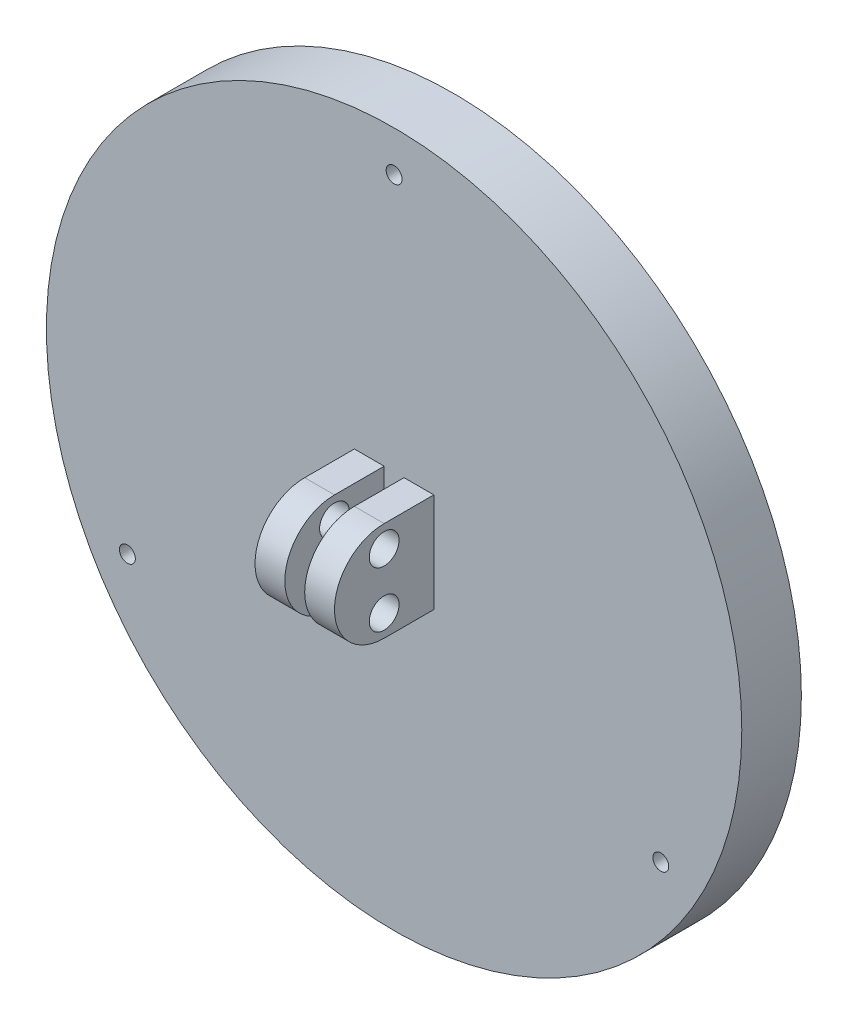
ISO-10303-21;
HEADER;
FILE_DESCRIPTION(('STEP AP214'),'2;1');
FILE_NAME('part.step','',(''),(''),'','','');
FILE_SCHEMA(('AUTOMOTIVE_DESIGN { 1 0 10303 214 1 1 1 1 }'));
ENDSEC;
DATA;
#1=APPLICATION_CONTEXT('core data for automotive mechanical design processes');
#2=APPLICATION_PROTOCOL_DEFINITION('international standard','automotive_design',2000,#1);
#3=PRODUCT_CONTEXT('',#1,'mechanical');
#4=PRODUCT('Part','Part','',(#3));
#5=PRODUCT_RELATED_PRODUCT_CATEGORY('part','',(#4));
#6=PRODUCT_DEFINITION_FORMATION('','',#4);
#7=PRODUCT_DEFINITION_CONTEXT('part definition',#1,'design');
#8=PRODUCT_DEFINITION('design','',#6,#7);
#9=PRODUCT_DEFINITION_SHAPE('','',#8);
#10=(LENGTH_UNIT() NAMED_UNIT(*) SI_UNIT(.MILLI.,.METRE.));
#11=(NAMED_UNIT(*) PLANE_ANGLE_UNIT() SI_UNIT($,.RADIAN.));
#12=(NAMED_UNIT(*) SI_UNIT($,.STERADIAN.) SOLID_ANGLE_UNIT());
#13=UNCERTAINTY_MEASURE_WITH_UNIT(LENGTH_MEASURE(1.E-05),#10,'distance_accuracy_value','');
#14=(GEOMETRIC_REPRESENTATION_CONTEXT(3) GLOBAL_UNCERTAINTY_ASSIGNED_CONTEXT((#13)) GLOBAL_UNIT_ASSIGNED_CONTEXT((#10,
#11,#12)) REPRESENTATION_CONTEXT('',''));
#15=CARTESIAN_POINT('',(0.,0.,0.));
#16=DIRECTION('',(0.,0.,1.));
#17=DIRECTION('',(1.,0.,0.));
#18=AXIS2_PLACEMENT_3D('',#15,#16,#17);
#19=CARTESIAN_POINT('',(0.999999999999999,5.,16.));
#20=DIRECTION('',(1.,0.,0.));
#21=DIRECTION('',(0.,1.,0.));
#22=AXIS2_PLACEMENT_3D('',#19,#20,#21);
#23=PLANE('',#22);
#24=CARTESIAN_POINT('',(1.,2.8,11.));
#25=DIRECTION('',(1.,0.,0.));
#26=DIRECTION('',(0.,1.,0.));
#27=AXIS2_PLACEMENT_3D('',#24,#25,#26);
#28=CIRCLE('',#27,1.5);
#29=CARTESIAN_POINT('',(1.,4.3,11.));
#30=VERTEX_POINT('',#29);
#31=EDGE_CURVE('E153',#30,#30,#28,.T.);
#32=ORIENTED_EDGE('',*,*,#31,.T.);
#33=EDGE_LOOP('',(#32));
#34=FACE_BOUND('',#33,.T.);
#35=CARTESIAN_POINT('',(1.,-2.8,11.));
#36=DIRECTION('',(1.,0.,0.));
#37=DIRECTION('',(0.,1.,0.));
#38=AXIS2_PLACEMENT_3D('',#35,#36,#37);
#39=CIRCLE('',#38,1.5);
#40=CARTESIAN_POINT('',(1.,-1.3,11.));
#41=VERTEX_POINT('',#40);
#42=EDGE_CURVE('E213',#41,#41,#39,.T.);
#43=ORIENTED_EDGE('',*,*,#42,.T.);
#44=EDGE_LOOP('',(#43));
#45=FACE_BOUND('',#44,.T.);
#46=DIRECTION('',(0.,0.,-1.));
#47=VECTOR('',#46,1.);
#48=CARTESIAN_POINT('',(1.,-5.,16.));
#49=LINE('',#48,#47);
#50=CARTESIAN_POINT('',(1.,-5.,11.));
#51=VERTEX_POINT('',#50);
#52=CARTESIAN_POINT('',(1.,-5.,6.));
#53=VERTEX_POINT('',#52);
#54=EDGE_CURVE('E160',#51,#53,#49,.T.);
#55=ORIENTED_EDGE('',*,*,#54,.F.);
#56=CARTESIAN_POINT('',(1.,0.,11.));
#57=DIRECTION('',(1.,0.,0.));
#58=DIRECTION('',(0.,1.,0.));
#59=AXIS2_PLACEMENT_3D('',#56,#57,#58);
#60=CIRCLE('',#59,5.);
#61=CARTESIAN_POINT('',(1.,5.,11.));
#62=VERTEX_POINT('',#61);
#63=EDGE_CURVE('E149',#51,#62,#60,.F.);
#64=ORIENTED_EDGE('',*,*,#63,.T.);
#65=DIRECTION('',(0.,0.,-1.));
#66=VECTOR('',#65,1.);
#67=CARTESIAN_POINT('',(0.999999999999999,5.,16.));
#68=LINE('',#67,#66);
#69=CARTESIAN_POINT('',(0.999999999999999,5.,6.));
#70=VERTEX_POINT('',#69);
#71=EDGE_CURVE('E166',#62,#70,#68,.T.);
#72=ORIENTED_EDGE('',*,*,#71,.T.);
#73=DIRECTION('',(0.,-1.,0.));
#74=VECTOR('',#73,1.);
#75=CARTESIAN_POINT('',(0.999999999999999,5.,6.));
#76=LINE('',#75,#74);
#77=EDGE_CURVE('E271',#70,#53,#76,.T.);
#78=ORIENTED_EDGE('',*,*,#77,.T.);
#79=EDGE_LOOP('',(#55,#64,#72,#78));
#80=FACE_BOUND('',#79,.T.);
#81=ADVANCED_FACE('F64',(#34,#45,#80),#23,.F.);
#82=CARTESIAN_POINT('',(4.,5.,16.));
#83=DIRECTION('',(-1.,0.,0.));
#84=DIRECTION('',(0.,-1.,0.));
#85=AXIS2_PLACEMENT_3D('',#82,#83,#84);
#86=PLANE('',#85);
#87=CARTESIAN_POINT('',(4.,2.8,11.));
#88=DIRECTION('',(1.,0.,0.));
#89=DIRECTION('',(0.,1.,0.));
#90=AXIS2_PLACEMENT_3D('',#87,#88,#89);
#91=CIRCLE('',#90,1.5);
#92=CARTESIAN_POINT('',(4.,4.3,11.));
#93=VERTEX_POINT('',#92);
#94=EDGE_CURVE('E207',#93,#93,#91,.T.);
#95=ORIENTED_EDGE('',*,*,#94,.F.);
#96=EDGE_LOOP('',(#95));
#97=FACE_BOUND('',#96,.T.);
#98=CARTESIAN_POINT('',(4.,-2.8,11.));
#99=DIRECTION('',(1.,0.,0.));
#100=DIRECTION('',(0.,1.,0.));
#101=AXIS2_PLACEMENT_3D('',#98,#99,#100);
#102=CIRCLE('',#101,1.5);
#103=CARTESIAN_POINT('',(4.,-1.3,11.));
#104=VERTEX_POINT('',#103);
#105=EDGE_CURVE('E216',#104,#104,#102,.T.);
#106=ORIENTED_EDGE('',*,*,#105,.F.);
#107=EDGE_LOOP('',(#106));
#108=FACE_BOUND('',#107,.T.);
#109=CARTESIAN_POINT('',(4.,0.,11.));
#110=DIRECTION('',(1.,0.,0.));
#111=DIRECTION('',(0.,1.,0.));
#112=AXIS2_PLACEMENT_3D('',#109,#110,#111);
#113=CIRCLE('',#112,5.);
#114=CARTESIAN_POINT('',(4.,-5.,11.));
#115=VERTEX_POINT('',#114);
#116=CARTESIAN_POINT('',(4.,5.,11.));
#117=VERTEX_POINT('',#116);
#118=EDGE_CURVE('E134',#115,#117,#113,.F.);
#119=ORIENTED_EDGE('',*,*,#118,.F.);
#120=DIRECTION('',(0.,0.,-1.));
#121=VECTOR('',#120,1.);
#122=CARTESIAN_POINT('',(4.,-5.,16.));
#123=LINE('',#122,#121);
#124=CARTESIAN_POINT('',(4.,-5.,6.));
#125=VERTEX_POINT('',#124);
#126=EDGE_CURVE('E138',#115,#125,#123,.T.);
#127=ORIENTED_EDGE('',*,*,#126,.T.);
#128=DIRECTION('',(0.,1.,0.));
#129=VECTOR('',#128,1.);
#130=CARTESIAN_POINT('',(4.,5.,6.));
#131=LINE('',#130,#129);
#132=CARTESIAN_POINT('',(4.,5.,6.));
#133=VERTEX_POINT('',#132);
#134=EDGE_CURVE('E277',#125,#133,#131,.T.);
#135=ORIENTED_EDGE('',*,*,#134,.T.);
#136=DIRECTION('',(0.,0.,-1.));
#137=VECTOR('',#136,1.);
#138=CARTESIAN_POINT('',(4.,5.,16.));
#139=LINE('',#138,#137);
#140=EDGE_CURVE('E90',#117,#133,#139,.T.);
#141=ORIENTED_EDGE('',*,*,#140,.F.);
#142=EDGE_LOOP('',(#119,#127,#135,#141));
#143=FACE_BOUND('',#142,.T.);
#144=ADVANCED_FACE('F136',(#97,#108,#143),#86,.F.);
#145=CARTESIAN_POINT('',(-1.,5.,16.));
#146=DIRECTION('',(-1.,0.,0.));
#147=DIRECTION('',(0.,-1.,0.));
#148=AXIS2_PLACEMENT_3D('',#145,#146,#147);
#149=PLANE('',#148);
#150=CARTESIAN_POINT('',(-1.,2.8,11.));
#151=DIRECTION('',(-1.,0.,0.));
#152=DIRECTION('',(0.,-1.,0.));
#153=AXIS2_PLACEMENT_3D('',#150,#151,#152);
#154=CIRCLE('',#153,1.5);
#155=CARTESIAN_POINT('',(-1.,1.3,11.));
#156=VERTEX_POINT('',#155);
#157=EDGE_CURVE('E227',#156,#156,#154,.T.);
#158=ORIENTED_EDGE('',*,*,#157,.T.);
#159=EDGE_LOOP('',(#158));
#160=FACE_BOUND('',#159,.T.);
#161=CARTESIAN_POINT('',(-1.,-2.8,11.));
#162=DIRECTION('',(-1.,0.,0.));
#163=DIRECTION('',(0.,-1.,0.));
#164=AXIS2_PLACEMENT_3D('',#161,#162,#163);
#165=CIRCLE('',#164,1.5);
#166=CARTESIAN_POINT('',(-1.,-4.3,11.));
#167=VERTEX_POINT('',#166);
#168=EDGE_CURVE('E206',#167,#167,#165,.T.);
#169=ORIENTED_EDGE('',*,*,#168,.T.);
#170=EDGE_LOOP('',(#169));
#171=FACE_BOUND('',#170,.T.);
#172=CARTESIAN_POINT('',(-1.,0.,11.));
#173=DIRECTION('',(-1.,0.,0.));
#174=DIRECTION('',(0.,-1.,0.));
#175=AXIS2_PLACEMENT_3D('',#172,#173,#174);
#176=CIRCLE('',#175,5.);
#177=CARTESIAN_POINT('',(-1.,5.,11.));
#178=VERTEX_POINT('',#177);
#179=CARTESIAN_POINT('',(-1.,-5.,11.));
#180=VERTEX_POINT('',#179);
#181=EDGE_CURVE('E241',#178,#180,#176,.F.);
#182=ORIENTED_EDGE('',*,*,#181,.T.);
#183=DIRECTION('',(0.,0.,-1.));
#184=VECTOR('',#183,1.);
#185=CARTESIAN_POINT('',(-0.999999999999999,-5.,16.));
#186=LINE('',#185,#184);
#187=CARTESIAN_POINT('',(-0.999999999999999,-5.,6.));
#188=VERTEX_POINT('',#187);
#189=EDGE_CURVE('E254',#180,#188,#186,.T.);
#190=ORIENTED_EDGE('',*,*,#189,.T.);
#191=DIRECTION('',(0.,1.,0.));
#192=VECTOR('',#191,1.);
#193=CARTESIAN_POINT('',(-1.,5.,6.));
#194=LINE('',#193,#192);
#195=CARTESIAN_POINT('',(-1.,5.,6.));
#196=VERTEX_POINT('',#195);
#197=EDGE_CURVE('E267',#188,#196,#194,.T.);
#198=ORIENTED_EDGE('',*,*,#197,.T.);
#199=DIRECTION('',(0.,0.,-1.));
#200=VECTOR('',#199,1.);
#201=CARTESIAN_POINT('',(-1.,5.,16.));
#202=LINE('',#201,#200);
#203=EDGE_CURVE('E246',#178,#196,#202,.T.);
#204=ORIENTED_EDGE('',*,*,#203,.F.);
#205=EDGE_LOOP('',(#182,#190,#198,#204));
#206=FACE_BOUND('',#205,.T.);
#207=ADVANCED_FACE('F304',(#160,#171,#206),#149,.F.);
#208=CARTESIAN_POINT('',(-4.,5.,16.));
#209=DIRECTION('',(1.,0.,0.));
#210=DIRECTION('',(0.,1.,0.));
#211=AXIS2_PLACEMENT_3D('',#208,#209,#210);
#212=PLANE('',#211);
#213=CARTESIAN_POINT('',(-4.,2.8,11.));
#214=DIRECTION('',(1.,0.,0.));
#215=DIRECTION('',(0.,1.,0.));
#216=AXIS2_PLACEMENT_3D('',#213,#214,#215);
#217=CIRCLE('',#216,1.5);
#218=CARTESIAN_POINT('',(-4.,4.3,11.));
#219=VERTEX_POINT('',#218);
#220=EDGE_CURVE('E68',#219,#219,#217,.T.);
#221=ORIENTED_EDGE('',*,*,#220,.T.);
#222=EDGE_LOOP('',(#221));
#223=FACE_BOUND('',#222,.T.);
#224=CARTESIAN_POINT('',(-4.,-2.8,11.));
#225=DIRECTION('',(1.,0.,0.));
#226=DIRECTION('',(0.,1.,0.));
#227=AXIS2_PLACEMENT_3D('',#224,#225,#226);
#228=CIRCLE('',#227,1.5);
#229=CARTESIAN_POINT('',(-4.,-1.3,11.));
#230=VERTEX_POINT('',#229);
#231=EDGE_CURVE('E203',#230,#230,#228,.T.);
#232=ORIENTED_EDGE('',*,*,#231,.T.);
#233=EDGE_LOOP('',(#232));
#234=FACE_BOUND('',#233,.T.);
#235=DIRECTION('',(0.,0.,-1.));
#236=VECTOR('',#235,1.);
#237=CARTESIAN_POINT('',(-4.,-5.,16.));
#238=LINE('',#237,#236);
#239=CARTESIAN_POINT('',(-4.,-5.,11.));
#240=VERTEX_POINT('',#239);
#241=CARTESIAN_POINT('',(-4.,-5.,6.));
#242=VERTEX_POINT('',#241);
#243=EDGE_CURVE('E82',#240,#242,#238,.T.);
#244=ORIENTED_EDGE('',*,*,#243,.F.);
#245=CARTESIAN_POINT('',(-4.,0.,11.));
#246=DIRECTION('',(1.,0.,0.));
#247=DIRECTION('',(0.,1.,0.));
#248=AXIS2_PLACEMENT_3D('',#245,#246,#247);
#249=CIRCLE('',#248,5.);
#250=CARTESIAN_POINT('',(-4.,5.,11.));
#251=VERTEX_POINT('',#250);
#252=EDGE_CURVE('E237',#240,#251,#249,.F.);
#253=ORIENTED_EDGE('',*,*,#252,.T.);
#254=DIRECTION('',(0.,0.,-1.));
#255=VECTOR('',#254,1.);
#256=CARTESIAN_POINT('',(-4.,5.,16.));
#257=LINE('',#256,#255);
#258=CARTESIAN_POINT('',(-4.,5.,6.));
#259=VERTEX_POINT('',#258);
#260=EDGE_CURVE('E249',#251,#259,#257,.T.);
#261=ORIENTED_EDGE('',*,*,#260,.T.);
#262=DIRECTION('',(0.,-1.,0.));
#263=VECTOR('',#262,1.);
#264=CARTESIAN_POINT('',(-4.,5.,6.));
#265=LINE('',#264,#263);
#266=EDGE_CURVE('E260',#259,#242,#265,.T.);
#267=ORIENTED_EDGE('',*,*,#266,.T.);
#268=EDGE_LOOP('',(#244,#253,#261,#267));
#269=FACE_BOUND('',#268,.T.);
#270=ADVANCED_FACE('F396',(#223,#234,#269),#212,.F.);
#271=CARTESIAN_POINT('',(0.999999999999999,5.,16.));
#272=DIRECTION('',(0.,-1.,0.));
#273=DIRECTION('',(0.,0.,-1.));
#274=AXIS2_PLACEMENT_3D('',#271,#272,#273);
#275=PLANE('',#274);
#276=DIRECTION('',(1.,0.,0.));
#277=VECTOR('',#276,1.);
#278=CARTESIAN_POINT('',(-35.,4.99999999999999,11.));
#279=LINE('',#278,#277);
#280=EDGE_CURVE('E142',#62,#117,#279,.T.);
#281=ORIENTED_EDGE('',*,*,#280,.T.);
#282=ORIENTED_EDGE('',*,*,#140,.T.);
#283=DIRECTION('',(-1.,0.,0.));
#284=VECTOR('',#283,1.);
#285=CARTESIAN_POINT('',(0.999999999999999,5.,6.));
#286=LINE('',#285,#284);
#287=EDGE_CURVE('E280',#133,#70,#286,.T.);
#288=ORIENTED_EDGE('',*,*,#287,.T.);
#289=ORIENTED_EDGE('',*,*,#71,.F.);
#290=EDGE_LOOP('',(#281,#282,#288,#289));
#291=FACE_BOUND('',#290,.T.);
#292=ADVANCED_FACE('F287',(#291),#275,.F.);
#293=CARTESIAN_POINT('',(-1.,5.,16.));
#294=DIRECTION('',(0.,-1.,0.));
#295=DIRECTION('',(0.,0.,-1.));
#296=AXIS2_PLACEMENT_3D('',#293,#294,#295);
#297=PLANE('',#296);
#298=EDGE_CURVE('E236',#251,#178,#279,.T.);
#299=ORIENTED_EDGE('',*,*,#298,.T.);
#300=ORIENTED_EDGE('',*,*,#203,.T.);
#301=DIRECTION('',(-1.,0.,0.));
#302=VECTOR('',#301,1.);
#303=CARTESIAN_POINT('',(-1.,5.,6.));
#304=LINE('',#303,#302);
#305=EDGE_CURVE('E263',#196,#259,#304,.T.);
#306=ORIENTED_EDGE('',*,*,#305,.T.);
#307=ORIENTED_EDGE('',*,*,#260,.F.);
#308=EDGE_LOOP('',(#299,#300,#306,#307));
#309=FACE_BOUND('',#308,.T.);
#310=ADVANCED_FACE('F292',(#309),#297,.F.);
#311=CARTESIAN_POINT('',(0.,0.,6.));
#312=DIRECTION('',(0.,0.,1.));
#313=DIRECTION('',(1.,0.,0.));
#314=AXIS2_PLACEMENT_3D('',#311,#312,#313);
#315=PLANE('',#314);
#316=CARTESIAN_POINT('',(0.,0.,6.));
#317=DIRECTION('',(0.,0.,1.));
#318=DIRECTION('',(1.,0.,0.));
#319=AXIS2_PLACEMENT_3D('',#316,#317,#318);
#320=CIRCLE('',#319,0.6);
#321=CARTESIAN_POINT('',(0.6,0.,6.));
#322=VERTEX_POINT('',#321);
#323=EDGE_CURVE('E164',#322,#322,#320,.T.);
#324=ORIENTED_EDGE('',*,*,#323,.F.);
#325=EDGE_LOOP('',(#324));
#326=FACE_BOUND('',#325,.T.);
#327=CARTESIAN_POINT('',(1.34704405012329E-12,30.9142781849874,6.));
#328=DIRECTION('',(0.,0.,1.));
#329=DIRECTION('',(1.,0.,0.));
#330=AXIS2_PLACEMENT_3D('',#327,#328,#329);
#331=CIRCLE('',#330,0.799999999999999);
#332=CARTESIAN_POINT('',(0.800000000001346,30.9142781849874,6.));
#333=VERTEX_POINT('',#332);
#334=EDGE_CURVE('E182',#333,#333,#331,.T.);
#335=ORIENTED_EDGE('',*,*,#334,.F.);
#336=EDGE_LOOP('',(#335));
#337=FACE_BOUND('',#336,.T.);
#338=CARTESIAN_POINT('',(26.8467875173189,-15.5857218150126,6.));
#339=DIRECTION('',(0.,0.,1.));
#340=DIRECTION('',(1.,0.,0.));
#341=AXIS2_PLACEMENT_3D('',#338,#339,#340);
#342=CIRCLE('',#341,0.799999999999999);
#343=CARTESIAN_POINT('',(27.6467875173189,-15.5857218150126,6.));
#344=VERTEX_POINT('',#343);
#345=EDGE_CURVE('E186',#344,#344,#342,.T.);
#346=ORIENTED_EDGE('',*,*,#345,.F.);
#347=EDGE_LOOP('',(#346));
#348=FACE_BOUND('',#347,.T.);
#349=CARTESIAN_POINT('',(-26.8467875173163,-15.5857218150126,6.));
#350=DIRECTION('',(0.,0.,1.));
#351=DIRECTION('',(1.,0.,0.));
#352=AXIS2_PLACEMENT_3D('',#349,#350,#351);
#353=CIRCLE('',#352,0.799999999999999);
#354=CARTESIAN_POINT('',(-26.0467875173163,-15.5857218150126,6.));
#355=VERTEX_POINT('',#354);
#356=EDGE_CURVE('E194',#355,#355,#353,.T.);
#357=ORIENTED_EDGE('',*,*,#356,.F.);
#358=EDGE_LOOP('',(#357));
#359=FACE_BOUND('',#358,.T.);
#360=CARTESIAN_POINT('',(0.,0.,6.));
#361=DIRECTION('',(0.,0.,1.));
#362=DIRECTION('',(1.,0.,0.));
#363=AXIS2_PLACEMENT_3D('',#360,#361,#362);
#364=CIRCLE('',#363,35.);
#365=CARTESIAN_POINT('',(35.,0.,6.));
#366=VERTEX_POINT('',#365);
#367=EDGE_CURVE('E12',#366,#366,#364,.T.);
#368=ORIENTED_EDGE('',*,*,#367,.T.);
#369=EDGE_LOOP('',(#368));
#370=FACE_BOUND('',#369,.T.);
#371=DIRECTION('',(1.,0.,0.));
#372=VECTOR('',#371,1.);
#373=CARTESIAN_POINT('',(1.,-5.,6.));
#374=LINE('',#373,#372);
#375=EDGE_CURVE('E157',#53,#125,#374,.T.);
#376=ORIENTED_EDGE('',*,*,#375,.F.);
#377=ORIENTED_EDGE('',*,*,#77,.F.);
#378=ORIENTED_EDGE('',*,*,#287,.F.);
#379=ORIENTED_EDGE('',*,*,#134,.F.);
#380=EDGE_LOOP('',(#376,#377,#378,#379));
#381=FACE_BOUND('',#380,.T.);
#382=ORIENTED_EDGE('',*,*,#305,.F.);
#383=ORIENTED_EDGE('',*,*,#197,.F.);
#384=DIRECTION('',(1.,0.,0.));
#385=VECTOR('',#384,1.);
#386=CARTESIAN_POINT('',(-0.999999999999999,-5.,6.));
#387=LINE('',#386,#385);
#388=EDGE_CURVE('E257',#242,#188,#387,.T.);
#389=ORIENTED_EDGE('',*,*,#388,.F.);
#390=ORIENTED_EDGE('',*,*,#266,.F.);
#391=EDGE_LOOP('',(#382,#383,#389,#390));
#392=FACE_BOUND('',#391,.T.);
#393=ADVANCED_FACE('F289',(#326,#337,#348,#359,#370,#381,#392),#315,.T.);
#394=CARTESIAN_POINT('',(0.,0.,6.));
#395=DIRECTION('',(0.,0.,-1.));
#396=DIRECTION('',(-1.,0.,0.));
#397=AXIS2_PLACEMENT_3D('',#394,#395,#396);
#398=CYLINDRICAL_SURFACE('',#397,35.);
#399=ORIENTED_EDGE('',*,*,#367,.F.);
#400=EDGE_LOOP('',(#399));
#401=FACE_BOUND('',#400,.T.);
#402=CARTESIAN_POINT('',(0.,0.,0.));
#403=DIRECTION('',(0.,0.,1.));
#404=DIRECTION('',(1.,0.,0.));
#405=AXIS2_PLACEMENT_3D('',#402,#403,#404);
#406=CIRCLE('',#405,35.);
#407=CARTESIAN_POINT('',(35.,0.,0.));
#408=VERTEX_POINT('',#407);
#409=EDGE_CURVE('E74',#408,#408,#406,.T.);
#410=ORIENTED_EDGE('',*,*,#409,.T.);
#411=EDGE_LOOP('',(#410));
#412=FACE_BOUND('',#411,.T.);
#413=ADVANCED_FACE('F66',(#401,#412),#398,.T.);
#414=CARTESIAN_POINT('',(0.,0.,0.));
#415=DIRECTION('',(0.,0.,1.));
#416=DIRECTION('',(1.,0.,0.));
#417=AXIS2_PLACEMENT_3D('',#414,#415,#416);
#418=PLANE('',#417);
#419=CARTESIAN_POINT('',(0.,0.,0.));
#420=DIRECTION('',(0.,0.,1.));
#421=DIRECTION('',(1.,0.,0.));
#422=AXIS2_PLACEMENT_3D('',#419,#420,#421);
#423=CIRCLE('',#422,0.6);
#424=CARTESIAN_POINT('',(0.6,0.,0.));
#425=VERTEX_POINT('',#424);
#426=EDGE_CURVE('E170',#425,#425,#423,.T.);
#427=ORIENTED_EDGE('',*,*,#426,.T.);
#428=EDGE_LOOP('',(#427));
#429=FACE_BOUND('',#428,.T.);
#430=CARTESIAN_POINT('',(1.34704405012329E-12,30.9142781849874,0.));
#431=DIRECTION('',(0.,0.,1.));
#432=DIRECTION('',(1.,0.,0.));
#433=AXIS2_PLACEMENT_3D('',#430,#431,#432);
#434=CIRCLE('',#433,0.799999999999999);
#435=CARTESIAN_POINT('',(0.800000000001346,30.9142781849874,0.));
#436=VERTEX_POINT('',#435);
#437=EDGE_CURVE('E178',#436,#436,#434,.T.);
#438=ORIENTED_EDGE('',*,*,#437,.T.);
#439=EDGE_LOOP('',(#438));
#440=FACE_BOUND('',#439,.T.);
#441=CARTESIAN_POINT('',(26.8467875173189,-15.5857218150126,0.));
#442=DIRECTION('',(0.,0.,1.));
#443=DIRECTION('',(1.,0.,0.));
#444=AXIS2_PLACEMENT_3D('',#441,#442,#443);
#445=CIRCLE('',#444,0.799999999999999);
#446=CARTESIAN_POINT('',(27.6467875173189,-15.5857218150126,0.));
#447=VERTEX_POINT('',#446);
#448=EDGE_CURVE('E190',#447,#447,#445,.T.);
#449=ORIENTED_EDGE('',*,*,#448,.T.);
#450=EDGE_LOOP('',(#449));
#451=FACE_BOUND('',#450,.T.);
#452=CARTESIAN_POINT('',(-26.8467875173163,-15.5857218150126,0.));
#453=DIRECTION('',(0.,0.,1.));
#454=DIRECTION('',(1.,0.,0.));
#455=AXIS2_PLACEMENT_3D('',#452,#453,#454);
#456=CIRCLE('',#455,0.799999999999999);
#457=CARTESIAN_POINT('',(-26.0467875173163,-15.5857218150126,0.));
#458=VERTEX_POINT('',#457);
#459=EDGE_CURVE('E174',#458,#458,#456,.T.);
#460=ORIENTED_EDGE('',*,*,#459,.T.);
#461=EDGE_LOOP('',(#460));
#462=FACE_BOUND('',#461,.T.);
#463=ORIENTED_EDGE('',*,*,#409,.F.);
#464=EDGE_LOOP('',(#463));
#465=FACE_BOUND('',#464,.T.);
#466=ADVANCED_FACE('F344',(#429,#440,#451,#462,#465),#418,.F.);
#467=CARTESIAN_POINT('',(-26.8467875173163,-15.5857218150126,0.));
#468=DIRECTION('',(0.,0.,1.));
#469=DIRECTION('',(1.,0.,0.));
#470=AXIS2_PLACEMENT_3D('',#467,#468,#469);
#471=CYLINDRICAL_SURFACE('',#470,0.799999999999999);
#472=ORIENTED_EDGE('',*,*,#459,.F.);
#473=EDGE_LOOP('',(#472));
#474=FACE_BOUND('',#473,.T.);
#475=ORIENTED_EDGE('',*,*,#356,.T.);
#476=EDGE_LOOP('',(#475));
#477=FACE_BOUND('',#476,.T.);
#478=ADVANCED_FACE('F341',(#474,#477),#471,.F.);
#479=CARTESIAN_POINT('',(26.8467875173189,-15.5857218150126,0.));
#480=DIRECTION('',(0.,0.,1.));
#481=DIRECTION('',(1.,0.,0.));
#482=AXIS2_PLACEMENT_3D('',#479,#480,#481);
#483=CYLINDRICAL_SURFACE('',#482,0.799999999999999);
#484=ORIENTED_EDGE('',*,*,#448,.F.);
#485=EDGE_LOOP('',(#484));
#486=FACE_BOUND('',#485,.T.);
#487=ORIENTED_EDGE('',*,*,#345,.T.);
#488=EDGE_LOOP('',(#487));
#489=FACE_BOUND('',#488,.T.);
#490=ADVANCED_FACE('F337',(#486,#489),#483,.F.);
#491=CARTESIAN_POINT('',(1.34704405012329E-12,30.9142781849874,0.));
#492=DIRECTION('',(0.,0.,1.));
#493=DIRECTION('',(1.,0.,0.));
#494=AXIS2_PLACEMENT_3D('',#491,#492,#493);
#495=CYLINDRICAL_SURFACE('',#494,0.799999999999999);
#496=ORIENTED_EDGE('',*,*,#437,.F.);
#497=EDGE_LOOP('',(#496));
#498=FACE_BOUND('',#497,.T.);
#499=ORIENTED_EDGE('',*,*,#334,.T.);
#500=EDGE_LOOP('',(#499));
#501=FACE_BOUND('',#500,.T.);
#502=ADVANCED_FACE('F333',(#498,#501),#495,.F.);
#503=CARTESIAN_POINT('',(0.,0.,0.));
#504=DIRECTION('',(0.,0.,1.));
#505=DIRECTION('',(1.,0.,0.));
#506=AXIS2_PLACEMENT_3D('',#503,#504,#505);
#507=CYLINDRICAL_SURFACE('',#506,0.6);
#508=ORIENTED_EDGE('',*,*,#426,.F.);
#509=EDGE_LOOP('',(#508));
#510=FACE_BOUND('',#509,.T.);
#511=ORIENTED_EDGE('',*,*,#323,.T.);
#512=EDGE_LOOP('',(#511));
#513=FACE_BOUND('',#512,.T.);
#514=ADVANCED_FACE('F317',(#510,#513),#507,.F.);
#515=CARTESIAN_POINT('',(1.,-5.,16.));
#516=DIRECTION('',(0.,1.,0.));
#517=DIRECTION('',(-1.,0.,0.));
#518=AXIS2_PLACEMENT_3D('',#515,#516,#517);
#519=PLANE('',#518);
#520=ORIENTED_EDGE('',*,*,#126,.F.);
#521=DIRECTION('',(1.,0.,0.));
#522=VECTOR('',#521,1.);
#523=CARTESIAN_POINT('',(-35.,-5.00000000000001,11.));
#524=LINE('',#523,#522);
#525=EDGE_CURVE('E146',#51,#115,#524,.T.);
#526=ORIENTED_EDGE('',*,*,#525,.F.);
#527=ORIENTED_EDGE('',*,*,#54,.T.);
#528=ORIENTED_EDGE('',*,*,#375,.T.);
#529=EDGE_LOOP('',(#520,#526,#527,#528));
#530=FACE_BOUND('',#529,.T.);
#531=ADVANCED_FACE('F155',(#530),#519,.F.);
#532=CARTESIAN_POINT('',(-0.999999999999999,-5.,16.));
#533=DIRECTION('',(0.,1.,0.));
#534=DIRECTION('',(0.,0.,1.));
#535=AXIS2_PLACEMENT_3D('',#532,#533,#534);
#536=PLANE('',#535);
#537=ORIENTED_EDGE('',*,*,#189,.F.);
#538=EDGE_CURVE('E143',#240,#180,#524,.T.);
#539=ORIENTED_EDGE('',*,*,#538,.F.);
#540=ORIENTED_EDGE('',*,*,#243,.T.);
#541=ORIENTED_EDGE('',*,*,#388,.T.);
#542=EDGE_LOOP('',(#537,#539,#540,#541));
#543=FACE_BOUND('',#542,.T.);
#544=ADVANCED_FACE('F307',(#543),#536,.F.);
#545=CARTESIAN_POINT('',(-35.,0.,11.));
#546=DIRECTION('',(1.,0.,0.));
#547=DIRECTION('',(0.,1.,0.));
#548=AXIS2_PLACEMENT_3D('',#545,#546,#547);
#549=CYLINDRICAL_SURFACE('',#548,5.);
#550=ORIENTED_EDGE('',*,*,#298,.F.);
#551=ORIENTED_EDGE('',*,*,#252,.F.);
#552=ORIENTED_EDGE('',*,*,#538,.T.);
#553=ORIENTED_EDGE('',*,*,#181,.F.);
#554=EDGE_LOOP('',(#550,#551,#552,#553));
#555=FACE_BOUND('',#554,.T.);
#556=ADVANCED_FACE('F309',(#555),#549,.T.);
#557=ORIENTED_EDGE('',*,*,#63,.F.);
#558=ORIENTED_EDGE('',*,*,#525,.T.);
#559=ORIENTED_EDGE('',*,*,#118,.T.);
#560=ORIENTED_EDGE('',*,*,#280,.F.);
#561=EDGE_LOOP('',(#557,#558,#559,#560));
#562=FACE_BOUND('',#561,.T.);
#563=ADVANCED_FACE('F147',(#562),#549,.T.);
#564=CARTESIAN_POINT('',(-35.,-2.80000000000001,11.));
#565=DIRECTION('',(1.,0.,0.));
#566=DIRECTION('',(0.,1.,0.));
#567=AXIS2_PLACEMENT_3D('',#564,#565,#566);
#568=CYLINDRICAL_SURFACE('',#567,1.5);
#569=ORIENTED_EDGE('',*,*,#231,.F.);
#570=EDGE_LOOP('',(#569));
#571=FACE_BOUND('',#570,.T.);
#572=ORIENTED_EDGE('',*,*,#168,.F.);
#573=EDGE_LOOP('',(#572));
#574=FACE_BOUND('',#573,.T.);
#575=ADVANCED_FACE('F430',(#571,#574),#568,.F.);
#576=CARTESIAN_POINT('',(-35.,2.79999999999999,11.));
#577=DIRECTION('',(1.,0.,0.));
#578=DIRECTION('',(0.,1.,0.));
#579=AXIS2_PLACEMENT_3D('',#576,#577,#578);
#580=CYLINDRICAL_SURFACE('',#579,1.5);
#581=ORIENTED_EDGE('',*,*,#220,.F.);
#582=EDGE_LOOP('',(#581));
#583=FACE_BOUND('',#582,.T.);
#584=ORIENTED_EDGE('',*,*,#157,.F.);
#585=EDGE_LOOP('',(#584));
#586=FACE_BOUND('',#585,.T.);
#587=ADVANCED_FACE('F522',(#583,#586),#580,.F.);
#588=ORIENTED_EDGE('',*,*,#105,.T.);
#589=EDGE_LOOP('',(#588));
#590=FACE_BOUND('',#589,.T.);
#591=ORIENTED_EDGE('',*,*,#42,.F.);
#592=EDGE_LOOP('',(#591));
#593=FACE_BOUND('',#592,.T.);
#594=ADVANCED_FACE('F525',(#590,#593),#568,.F.);
#595=ORIENTED_EDGE('',*,*,#94,.T.);
#596=EDGE_LOOP('',(#595));
#597=FACE_BOUND('',#596,.T.);
#598=ORIENTED_EDGE('',*,*,#31,.F.);
#599=EDGE_LOOP('',(#598));
#600=FACE_BOUND('',#599,.T.);
#601=ADVANCED_FACE('F534',(#597,#600),#580,.F.);
#602=CLOSED_SHELL('',(#81,#144,#207,#270,#292,#310,#393,#413,#466,#478,#490,#502,#514,#531,#544,
#556,#563,#575,#587,#594,#601));
#603=MANIFOLD_SOLID_BREP('B2',#602);
#604=ADVANCED_BREP_SHAPE_REPRESENTATION('',(#18,#603),#14);
#605=SHAPE_DEFINITION_REPRESENTATION(#9,#604);
ENDSEC;
END-ISO-10303-21;
